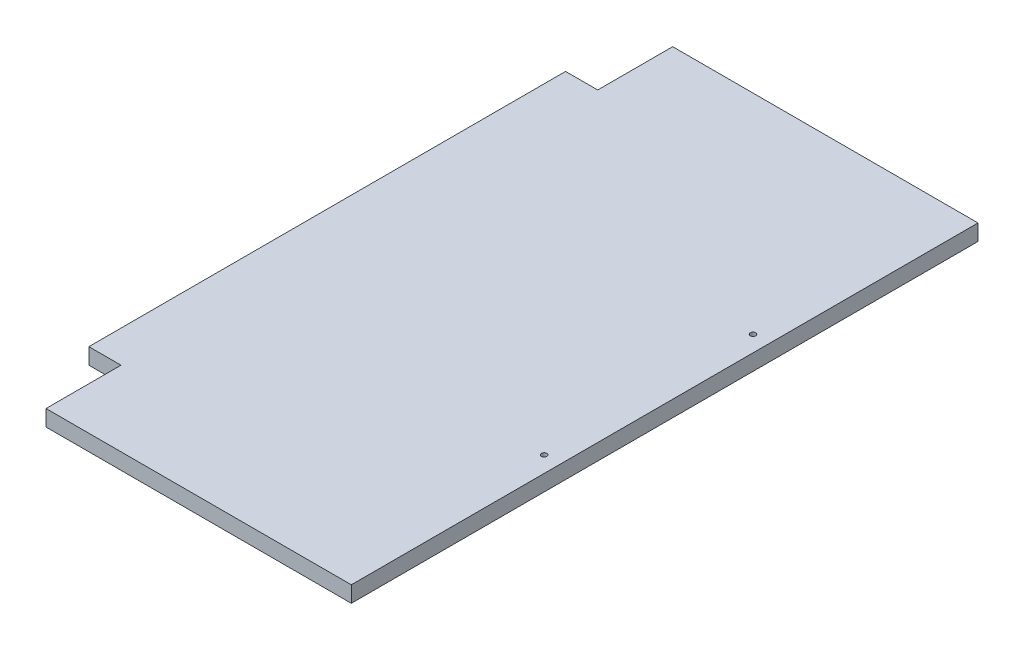
ISO-10303-21;
HEADER;
FILE_DESCRIPTION(('STEP AP214'),'2;1');
FILE_NAME('part.step','',(''),(''),'','','');
FILE_SCHEMA(('AUTOMOTIVE_DESIGN { 1 0 10303 214 1 1 1 1 }'));
ENDSEC;
DATA;
#1=APPLICATION_CONTEXT('core data for automotive mechanical design processes');
#2=APPLICATION_PROTOCOL_DEFINITION('international standard','automotive_design',2000,#1);
#3=PRODUCT_CONTEXT('',#1,'mechanical');
#4=PRODUCT('Part','Part','',(#3));
#5=PRODUCT_RELATED_PRODUCT_CATEGORY('part','',(#4));
#6=PRODUCT_DEFINITION_FORMATION('','',#4);
#7=PRODUCT_DEFINITION_CONTEXT('part definition',#1,'design');
#8=PRODUCT_DEFINITION('design','',#6,#7);
#9=PRODUCT_DEFINITION_SHAPE('','',#8);
#10=(LENGTH_UNIT() NAMED_UNIT(*) SI_UNIT(.MILLI.,.METRE.));
#11=(NAMED_UNIT(*) PLANE_ANGLE_UNIT() SI_UNIT($,.RADIAN.));
#12=(NAMED_UNIT(*) SI_UNIT($,.STERADIAN.) SOLID_ANGLE_UNIT());
#13=UNCERTAINTY_MEASURE_WITH_UNIT(LENGTH_MEASURE(1.E-05),#10,'distance_accuracy_value','');
#14=(GEOMETRIC_REPRESENTATION_CONTEXT(3) GLOBAL_UNCERTAINTY_ASSIGNED_CONTEXT((#13)) GLOBAL_UNIT_ASSIGNED_CONTEXT((#10,
#11,#12)) REPRESENTATION_CONTEXT('',''));
#15=CARTESIAN_POINT('',(0.,0.,0.));
#16=DIRECTION('',(0.,0.,1.));
#17=DIRECTION('',(1.,0.,0.));
#18=AXIS2_PLACEMENT_3D('',#15,#16,#17);
#19=CARTESIAN_POINT('',(0.,19.05,0.));
#20=DIRECTION('',(0.,-1.,0.));
#21=DIRECTION('',(0.,0.,-1.));
#22=AXIS2_PLACEMENT_3D('',#19,#20,#21);
#23=PLANE('',#22);
#24=DIRECTION('',(0.,0.,1.));
#25=VECTOR('',#24,1.);
#26=CARTESIAN_POINT('',(0.,19.05,565.15));
#27=LINE('',#26,#25);
#28=CARTESIAN_POINT('',(0.,19.05,0.));
#29=VERTEX_POINT('',#28);
#30=CARTESIAN_POINT('',(0.,19.05,565.15));
#31=VERTEX_POINT('',#30);
#32=EDGE_CURVE('E164',#29,#31,#27,.T.);
#33=ORIENTED_EDGE('',*,*,#32,.T.);
#34=DIRECTION('',(1.,0.,0.));
#35=VECTOR('',#34,1.);
#36=CARTESIAN_POINT('',(38.1,19.05,565.15));
#37=LINE('',#36,#35);
#38=CARTESIAN_POINT('',(38.1,19.05,565.15));
#39=VERTEX_POINT('',#38);
#40=EDGE_CURVE('E100',#31,#39,#37,.T.);
#41=ORIENTED_EDGE('',*,*,#40,.T.);
#42=DIRECTION('',(0.,0.,1.));
#43=VECTOR('',#42,1.);
#44=CARTESIAN_POINT('',(38.1,19.05,654.05));
#45=LINE('',#44,#43);
#46=CARTESIAN_POINT('',(38.1,19.05,654.05));
#47=VERTEX_POINT('',#46);
#48=EDGE_CURVE('E185',#39,#47,#45,.T.);
#49=ORIENTED_EDGE('',*,*,#48,.T.);
#50=DIRECTION('',(1.,0.,0.));
#51=VECTOR('',#50,1.);
#52=CARTESIAN_POINT('',(400.05,19.05,654.05));
#53=LINE('',#52,#51);
#54=CARTESIAN_POINT('',(400.05,19.05,654.05));
#55=VERTEX_POINT('',#54);
#56=EDGE_CURVE('E199',#47,#55,#53,.T.);
#57=ORIENTED_EDGE('',*,*,#56,.T.);
#58=DIRECTION('',(0.,0.,-1.));
#59=VECTOR('',#58,1.);
#60=CARTESIAN_POINT('',(400.05,19.05,-88.9));
#61=LINE('',#60,#59);
#62=CARTESIAN_POINT('',(400.05,19.05,-88.9));
#63=VERTEX_POINT('',#62);
#64=EDGE_CURVE('E119',#55,#63,#61,.T.);
#65=ORIENTED_EDGE('',*,*,#64,.T.);
#66=DIRECTION('',(-1.,0.,0.));
#67=VECTOR('',#66,1.);
#68=CARTESIAN_POINT('',(38.1,19.05,-88.9));
#69=LINE('',#68,#67);
#70=CARTESIAN_POINT('',(38.1,19.05,-88.9));
#71=VERTEX_POINT('',#70);
#72=EDGE_CURVE('E113',#63,#71,#69,.T.);
#73=ORIENTED_EDGE('',*,*,#72,.T.);
#74=DIRECTION('',(0.,0.,1.));
#75=VECTOR('',#74,1.);
#76=CARTESIAN_POINT('',(38.1,19.05,0.));
#77=LINE('',#76,#75);
#78=CARTESIAN_POINT('',(38.1,19.05,0.));
#79=VERTEX_POINT('',#78);
#80=EDGE_CURVE('E117',#71,#79,#77,.T.);
#81=ORIENTED_EDGE('',*,*,#80,.T.);
#82=DIRECTION('',(-1.,0.,0.));
#83=VECTOR('',#82,1.);
#84=CARTESIAN_POINT('',(0.,19.05,0.));
#85=LINE('',#84,#83);
#86=EDGE_CURVE('E57',#79,#29,#85,.T.);
#87=ORIENTED_EDGE('',*,*,#86,.T.);
#88=EDGE_LOOP('',(#33,#41,#49,#57,#65,#73,#81,#87));
#89=FACE_BOUND('',#88,.T.);
#90=CARTESIAN_POINT('',(381.,19.05,406.4));
#91=DIRECTION('',(0.,1.,0.));
#92=DIRECTION('',(0.,0.,1.));
#93=AXIS2_PLACEMENT_3D('',#90,#91,#92);
#94=CIRCLE('',#93,3.17499999999997);
#95=CARTESIAN_POINT('',(381.,19.05,403.225));
#96=VERTEX_POINT('',#95);
#97=EDGE_CURVE('E146',#96,#96,#94,.T.);
#98=ORIENTED_EDGE('',*,*,#97,.F.);
#99=EDGE_LOOP('',(#98));
#100=FACE_BOUND('',#99,.T.);
#101=CARTESIAN_POINT('',(381.,19.05,158.75));
#102=DIRECTION('',(0.,1.,0.));
#103=DIRECTION('',(0.,0.,1.));
#104=AXIS2_PLACEMENT_3D('',#101,#102,#103);
#105=CIRCLE('',#104,3.17499999999997);
#106=CARTESIAN_POINT('',(381.,19.05,155.575));
#107=VERTEX_POINT('',#106);
#108=EDGE_CURVE('E213',#107,#107,#105,.T.);
#109=ORIENTED_EDGE('',*,*,#108,.F.);
#110=EDGE_LOOP('',(#109));
#111=FACE_BOUND('',#110,.T.);
#112=ADVANCED_FACE('F39',(#89,#100,#111),#23,.F.);
#113=CARTESIAN_POINT('',(0.,0.,0.));
#114=DIRECTION('',(0.,-1.,0.));
#115=DIRECTION('',(0.,0.,-1.));
#116=AXIS2_PLACEMENT_3D('',#113,#114,#115);
#117=PLANE('',#116);
#118=CARTESIAN_POINT('',(381.,0.,406.4));
#119=DIRECTION('',(0.,1.,0.));
#120=DIRECTION('',(0.,0.,1.));
#121=AXIS2_PLACEMENT_3D('',#118,#119,#120);
#122=CIRCLE('',#121,3.17499999999997);
#123=CARTESIAN_POINT('',(381.,0.,403.225));
#124=VERTEX_POINT('',#123);
#125=EDGE_CURVE('E209',#124,#124,#122,.T.);
#126=ORIENTED_EDGE('',*,*,#125,.T.);
#127=EDGE_LOOP('',(#126));
#128=FACE_BOUND('',#127,.T.);
#129=DIRECTION('',(0.,0.,1.));
#130=VECTOR('',#129,1.);
#131=CARTESIAN_POINT('',(0.,0.,565.15));
#132=LINE('',#131,#130);
#133=CARTESIAN_POINT('',(0.,0.,0.));
#134=VERTEX_POINT('',#133);
#135=CARTESIAN_POINT('',(0.,0.,565.15));
#136=VERTEX_POINT('',#135);
#137=EDGE_CURVE('E141',#134,#136,#132,.T.);
#138=ORIENTED_EDGE('',*,*,#137,.F.);
#139=DIRECTION('',(-1.,0.,0.));
#140=VECTOR('',#139,1.);
#141=CARTESIAN_POINT('',(0.,0.,0.));
#142=LINE('',#141,#140);
#143=CARTESIAN_POINT('',(38.1,0.,0.));
#144=VERTEX_POINT('',#143);
#145=EDGE_CURVE('E92',#144,#134,#142,.T.);
#146=ORIENTED_EDGE('',*,*,#145,.F.);
#147=DIRECTION('',(0.,0.,1.));
#148=VECTOR('',#147,1.);
#149=CARTESIAN_POINT('',(38.1,0.,0.));
#150=LINE('',#149,#148);
#151=CARTESIAN_POINT('',(38.1,0.,-88.9));
#152=VERTEX_POINT('',#151);
#153=EDGE_CURVE('E86',#152,#144,#150,.T.);
#154=ORIENTED_EDGE('',*,*,#153,.F.);
#155=DIRECTION('',(-1.,0.,0.));
#156=VECTOR('',#155,1.);
#157=CARTESIAN_POINT('',(38.1,0.,-88.9));
#158=LINE('',#157,#156);
#159=CARTESIAN_POINT('',(400.05,0.,-88.9));
#160=VERTEX_POINT('',#159);
#161=EDGE_CURVE('E128',#160,#152,#158,.T.);
#162=ORIENTED_EDGE('',*,*,#161,.F.);
#163=DIRECTION('',(0.,0.,-1.));
#164=VECTOR('',#163,1.);
#165=CARTESIAN_POINT('',(400.05,0.,-88.9));
#166=LINE('',#165,#164);
#167=CARTESIAN_POINT('',(400.05,0.,654.05));
#168=VERTEX_POINT('',#167);
#169=EDGE_CURVE('E155',#168,#160,#166,.T.);
#170=ORIENTED_EDGE('',*,*,#169,.F.);
#171=DIRECTION('',(1.,0.,0.));
#172=VECTOR('',#171,1.);
#173=CARTESIAN_POINT('',(400.05,0.,654.05));
#174=LINE('',#173,#172);
#175=CARTESIAN_POINT('',(38.1,0.,654.05));
#176=VERTEX_POINT('',#175);
#177=EDGE_CURVE('E152',#176,#168,#174,.T.);
#178=ORIENTED_EDGE('',*,*,#177,.F.);
#179=DIRECTION('',(0.,0.,1.));
#180=VECTOR('',#179,1.);
#181=CARTESIAN_POINT('',(38.1,0.,654.05));
#182=LINE('',#181,#180);
#183=CARTESIAN_POINT('',(38.1,0.,565.15));
#184=VERTEX_POINT('',#183);
#185=EDGE_CURVE('E149',#184,#176,#182,.T.);
#186=ORIENTED_EDGE('',*,*,#185,.F.);
#187=DIRECTION('',(1.,0.,0.));
#188=VECTOR('',#187,1.);
#189=CARTESIAN_POINT('',(38.1,0.,565.15));
#190=LINE('',#189,#188);
#191=EDGE_CURVE('E145',#136,#184,#190,.T.);
#192=ORIENTED_EDGE('',*,*,#191,.F.);
#193=EDGE_LOOP('',(#138,#146,#154,#162,#170,#178,#186,#192));
#194=FACE_BOUND('',#193,.T.);
#195=CARTESIAN_POINT('',(381.,0.,158.75));
#196=DIRECTION('',(0.,1.,0.));
#197=DIRECTION('',(0.,0.,1.));
#198=AXIS2_PLACEMENT_3D('',#195,#196,#197);
#199=CIRCLE('',#198,3.17499999999997);
#200=CARTESIAN_POINT('',(381.,0.,155.575));
#201=VERTEX_POINT('',#200);
#202=EDGE_CURVE('E217',#201,#201,#199,.T.);
#203=ORIENTED_EDGE('',*,*,#202,.T.);
#204=EDGE_LOOP('',(#203));
#205=FACE_BOUND('',#204,.T.);
#206=ADVANCED_FACE('F189',(#128,#194,#205),#117,.T.);
#207=CARTESIAN_POINT('',(0.,19.05,565.15));
#208=DIRECTION('',(1.,0.,0.));
#209=DIRECTION('',(0.,0.,-1.));
#210=AXIS2_PLACEMENT_3D('',#207,#208,#209);
#211=PLANE('',#210);
#212=ORIENTED_EDGE('',*,*,#137,.T.);
#213=DIRECTION('',(0.,-1.,0.));
#214=VECTOR('',#213,1.);
#215=CARTESIAN_POINT('',(0.,19.05,565.15));
#216=LINE('',#215,#214);
#217=EDGE_CURVE('E11',#31,#136,#216,.T.);
#218=ORIENTED_EDGE('',*,*,#217,.F.);
#219=ORIENTED_EDGE('',*,*,#32,.F.);
#220=DIRECTION('',(0.,-1.,0.));
#221=VECTOR('',#220,1.);
#222=CARTESIAN_POINT('',(0.,19.05,0.));
#223=LINE('',#222,#221);
#224=EDGE_CURVE('E137',#29,#134,#223,.T.);
#225=ORIENTED_EDGE('',*,*,#224,.T.);
#226=EDGE_LOOP('',(#212,#218,#219,#225));
#227=FACE_BOUND('',#226,.T.);
#228=ADVANCED_FACE('F41',(#227),#211,.F.);
#229=CARTESIAN_POINT('',(38.1,19.05,565.15));
#230=DIRECTION('',(0.,0.,-1.));
#231=DIRECTION('',(-1.,0.,0.));
#232=AXIS2_PLACEMENT_3D('',#229,#230,#231);
#233=PLANE('',#232);
#234=ORIENTED_EDGE('',*,*,#191,.T.);
#235=DIRECTION('',(0.,-1.,0.));
#236=VECTOR('',#235,1.);
#237=CARTESIAN_POINT('',(38.1,19.05,565.15));
#238=LINE('',#237,#236);
#239=EDGE_CURVE('E49',#39,#184,#238,.T.);
#240=ORIENTED_EDGE('',*,*,#239,.F.);
#241=ORIENTED_EDGE('',*,*,#40,.F.);
#242=ORIENTED_EDGE('',*,*,#217,.T.);
#243=EDGE_LOOP('',(#234,#240,#241,#242));
#244=FACE_BOUND('',#243,.T.);
#245=ADVANCED_FACE('F251',(#244),#233,.F.);
#246=CARTESIAN_POINT('',(38.1,19.05,654.05));
#247=DIRECTION('',(1.,0.,0.));
#248=DIRECTION('',(0.,0.,-1.));
#249=AXIS2_PLACEMENT_3D('',#246,#247,#248);
#250=PLANE('',#249);
#251=ORIENTED_EDGE('',*,*,#185,.T.);
#252=DIRECTION('',(0.,-1.,0.));
#253=VECTOR('',#252,1.);
#254=CARTESIAN_POINT('',(38.1,19.05,654.05));
#255=LINE('',#254,#253);
#256=EDGE_CURVE('E175',#47,#176,#255,.T.);
#257=ORIENTED_EDGE('',*,*,#256,.F.);
#258=ORIENTED_EDGE('',*,*,#48,.F.);
#259=ORIENTED_EDGE('',*,*,#239,.T.);
#260=EDGE_LOOP('',(#251,#257,#258,#259));
#261=FACE_BOUND('',#260,.T.);
#262=ADVANCED_FACE('F183',(#261),#250,.F.);
#263=CARTESIAN_POINT('',(400.05,19.05,654.05));
#264=DIRECTION('',(0.,0.,-1.));
#265=DIRECTION('',(-1.,0.,0.));
#266=AXIS2_PLACEMENT_3D('',#263,#264,#265);
#267=PLANE('',#266);
#268=ORIENTED_EDGE('',*,*,#177,.T.);
#269=DIRECTION('',(0.,-1.,0.));
#270=VECTOR('',#269,1.);
#271=CARTESIAN_POINT('',(400.05,19.05,654.05));
#272=LINE('',#271,#270);
#273=EDGE_CURVE('E171',#55,#168,#272,.T.);
#274=ORIENTED_EDGE('',*,*,#273,.F.);
#275=ORIENTED_EDGE('',*,*,#56,.F.);
#276=ORIENTED_EDGE('',*,*,#256,.T.);
#277=EDGE_LOOP('',(#268,#274,#275,#276));
#278=FACE_BOUND('',#277,.T.);
#279=ADVANCED_FACE('F194',(#278),#267,.F.);
#280=CARTESIAN_POINT('',(400.05,19.05,-88.9));
#281=DIRECTION('',(-1.,0.,0.));
#282=DIRECTION('',(0.,0.,1.));
#283=AXIS2_PLACEMENT_3D('',#280,#281,#282);
#284=PLANE('',#283);
#285=ORIENTED_EDGE('',*,*,#169,.T.);
#286=DIRECTION('',(0.,-1.,0.));
#287=VECTOR('',#286,1.);
#288=CARTESIAN_POINT('',(400.05,19.05,-88.9));
#289=LINE('',#288,#287);
#290=EDGE_CURVE('E130',#63,#160,#289,.T.);
#291=ORIENTED_EDGE('',*,*,#290,.F.);
#292=ORIENTED_EDGE('',*,*,#64,.F.);
#293=ORIENTED_EDGE('',*,*,#273,.T.);
#294=EDGE_LOOP('',(#285,#291,#292,#293));
#295=FACE_BOUND('',#294,.T.);
#296=ADVANCED_FACE('F197',(#295),#284,.F.);
#297=CARTESIAN_POINT('',(38.1,19.05,-88.9));
#298=DIRECTION('',(0.,0.,1.));
#299=DIRECTION('',(1.,0.,0.));
#300=AXIS2_PLACEMENT_3D('',#297,#298,#299);
#301=PLANE('',#300);
#302=ORIENTED_EDGE('',*,*,#161,.T.);
#303=DIRECTION('',(0.,-1.,0.));
#304=VECTOR('',#303,1.);
#305=CARTESIAN_POINT('',(38.1,19.05,-88.9));
#306=LINE('',#305,#304);
#307=EDGE_CURVE('E125',#71,#152,#306,.T.);
#308=ORIENTED_EDGE('',*,*,#307,.F.);
#309=ORIENTED_EDGE('',*,*,#72,.F.);
#310=ORIENTED_EDGE('',*,*,#290,.T.);
#311=EDGE_LOOP('',(#302,#308,#309,#310));
#312=FACE_BOUND('',#311,.T.);
#313=ADVANCED_FACE('F126',(#312),#301,.F.);
#314=CARTESIAN_POINT('',(38.1,19.05,0.));
#315=DIRECTION('',(1.,0.,0.));
#316=DIRECTION('',(0.,0.,-1.));
#317=AXIS2_PLACEMENT_3D('',#314,#315,#316);
#318=PLANE('',#317);
#319=ORIENTED_EDGE('',*,*,#153,.T.);
#320=DIRECTION('',(0.,-1.,0.));
#321=VECTOR('',#320,1.);
#322=CARTESIAN_POINT('',(38.1,19.05,0.));
#323=LINE('',#322,#321);
#324=EDGE_CURVE('E131',#79,#144,#323,.T.);
#325=ORIENTED_EDGE('',*,*,#324,.F.);
#326=ORIENTED_EDGE('',*,*,#80,.F.);
#327=ORIENTED_EDGE('',*,*,#307,.T.);
#328=EDGE_LOOP('',(#319,#325,#326,#327));
#329=FACE_BOUND('',#328,.T.);
#330=ADVANCED_FACE('F133',(#329),#318,.F.);
#331=CARTESIAN_POINT('',(0.,19.05,0.));
#332=DIRECTION('',(0.,0.,1.));
#333=DIRECTION('',(1.,0.,0.));
#334=AXIS2_PLACEMENT_3D('',#331,#332,#333);
#335=PLANE('',#334);
#336=ORIENTED_EDGE('',*,*,#145,.T.);
#337=ORIENTED_EDGE('',*,*,#224,.F.);
#338=ORIENTED_EDGE('',*,*,#86,.F.);
#339=ORIENTED_EDGE('',*,*,#324,.T.);
#340=EDGE_LOOP('',(#336,#337,#338,#339));
#341=FACE_BOUND('',#340,.T.);
#342=ADVANCED_FACE('F239',(#341),#335,.F.);
#343=CARTESIAN_POINT('',(381.,19.05,406.4));
#344=DIRECTION('',(0.,-1.,0.));
#345=DIRECTION('',(0.,0.,-1.));
#346=AXIS2_PLACEMENT_3D('',#343,#344,#345);
#347=CYLINDRICAL_SURFACE('',#346,3.17499999999997);
#348=CARTESIAN_POINT('',(381.,19.05,403.225));
#349=CARTESIAN_POINT('',(381.,18.8515625,403.225));
#350=CARTESIAN_POINT('',(381.,18.653125,403.225));
#351=CARTESIAN_POINT('',(381.,18.25625,403.225));
#352=CARTESIAN_POINT('',(381.,18.0578125,403.225));
#353=CARTESIAN_POINT('',(381.,17.6609375,403.225));
#354=CARTESIAN_POINT('',(381.,17.4625,403.225));
#355=CARTESIAN_POINT('',(381.,17.065625,403.225));
#356=CARTESIAN_POINT('',(381.,16.8671875,403.225));
#357=CARTESIAN_POINT('',(381.,16.4703125,403.225));
#358=CARTESIAN_POINT('',(381.,16.271875,403.225));
#359=CARTESIAN_POINT('',(381.,15.875,403.225));
#360=CARTESIAN_POINT('',(381.,15.6765625,403.225));
#361=CARTESIAN_POINT('',(381.,15.2796875,403.225));
#362=CARTESIAN_POINT('',(381.,15.08125,403.225));
#363=CARTESIAN_POINT('',(381.,14.684375,403.225));
#364=CARTESIAN_POINT('',(381.,14.4859375,403.225));
#365=CARTESIAN_POINT('',(381.,14.0890625,403.225));
#366=CARTESIAN_POINT('',(381.,13.890625,403.225));
#367=CARTESIAN_POINT('',(381.,13.49375,403.225));
#368=CARTESIAN_POINT('',(381.,13.2953125,403.225));
#369=CARTESIAN_POINT('',(381.,12.8984375,403.225));
#370=CARTESIAN_POINT('',(381.,12.7,403.225));
#371=CARTESIAN_POINT('',(381.,12.303125,403.225));
#372=CARTESIAN_POINT('',(381.,12.1046875,403.225));
#373=CARTESIAN_POINT('',(381.,11.7078125,403.225));
#374=CARTESIAN_POINT('',(381.,11.509375,403.225));
#375=CARTESIAN_POINT('',(381.,11.1125,403.225));
#376=CARTESIAN_POINT('',(381.,10.9140625,403.225));
#377=CARTESIAN_POINT('',(381.,10.5171875,403.225));
#378=CARTESIAN_POINT('',(381.,10.31875,403.225));
#379=CARTESIAN_POINT('',(381.,9.921875,403.225));
#380=CARTESIAN_POINT('',(381.,9.7234375,403.225));
#381=CARTESIAN_POINT('',(381.,9.3265625,403.225));
#382=CARTESIAN_POINT('',(381.,9.128125,403.225));
#383=CARTESIAN_POINT('',(381.,8.73125,403.225));
#384=CARTESIAN_POINT('',(381.,8.5328125,403.225));
#385=CARTESIAN_POINT('',(381.,8.1359375,403.225));
#386=CARTESIAN_POINT('',(381.,7.9375,403.225));
#387=CARTESIAN_POINT('',(381.,7.540625,403.225));
#388=CARTESIAN_POINT('',(381.,7.3421875,403.225));
#389=CARTESIAN_POINT('',(381.,6.9453125,403.225));
#390=CARTESIAN_POINT('',(381.,6.746875,403.225));
#391=CARTESIAN_POINT('',(381.,6.35,403.225));
#392=CARTESIAN_POINT('',(381.,6.1515625,403.225));
#393=CARTESIAN_POINT('',(381.,5.7546875,403.225));
#394=CARTESIAN_POINT('',(381.,5.55625,403.225));
#395=CARTESIAN_POINT('',(381.,5.159375,403.225));
#396=CARTESIAN_POINT('',(381.,4.9609375,403.225));
#397=CARTESIAN_POINT('',(381.,4.5640625,403.225));
#398=CARTESIAN_POINT('',(381.,4.365625,403.225));
#399=CARTESIAN_POINT('',(381.,3.96875,403.225));
#400=CARTESIAN_POINT('',(381.,3.7703125,403.225));
#401=CARTESIAN_POINT('',(381.,3.3734375,403.225));
#402=CARTESIAN_POINT('',(381.,3.175,403.225));
#403=CARTESIAN_POINT('',(381.,2.778125,403.225));
#404=CARTESIAN_POINT('',(381.,2.5796875,403.225));
#405=CARTESIAN_POINT('',(381.,2.1828125,403.225));
#406=CARTESIAN_POINT('',(381.,1.984375,403.225));
#407=CARTESIAN_POINT('',(381.,1.5875,403.225));
#408=CARTESIAN_POINT('',(381.,1.3890625,403.225));
#409=CARTESIAN_POINT('',(381.,0.992187500000001,403.225));
#410=CARTESIAN_POINT('',(381.,0.793750000000001,403.225));
#411=CARTESIAN_POINT('',(381.,0.396875,403.225));
#412=CARTESIAN_POINT('',(381.,0.1984375,403.225));
#413=CARTESIAN_POINT('',(381.,0.,403.225));
#414=B_SPLINE_CURVE_WITH_KNOTS('',3,(#348,#349,#350,#351,#352,#353,#354,#355,#356,#357,#358,
#359,#360,#361,#362,#363,#364,#365,#366,#367,#368,#369,#370,#371,#372,#373,#374,#375,#376,#377,
#378,#379,#380,#381,#382,#383,#384,#385,#386,#387,#388,#389,#390,#391,#392,#393,#394,#395,#396,
#397,#398,#399,#400,#401,#402,#403,#404,#405,#406,#407,#408,#409,#410,#411,#412,#413),
.UNSPECIFIED.,.F.,.F.,(4,2,2,2,2,2,2,2,2,2,2,2,2,2,2,2,2,2,2,2,2,2,2,2,2,2,2,2,2,2,2,2,4),(0.,
0.595312499999997,1.190625,1.7859375,2.38125,2.9765625,3.571875,4.1671875,4.7625,5.3578125,
5.953125,6.5484375,7.14375,7.7390625,8.334375,8.9296875,9.525,10.1203125,10.715625,11.3109375,
11.90625,12.5015625,13.096875,13.6921875,14.2875,14.8828125,15.478125,16.0734375,16.66875,
17.2640625,17.859375,18.4546875,19.05),.UNSPECIFIED.);
#415=EDGE_CURVE('BSEAM236',#96,#124,#414,.T.);
#416=ORIENTED_EDGE('',*,*,#97,.T.);
#417=ORIENTED_EDGE('',*,*,#125,.F.);
#418=ORIENTED_EDGE('',*,*,#415,.T.);
#419=ORIENTED_EDGE('',*,*,#415,.F.);
#420=EDGE_LOOP('',(#416,#418,#417,#419));
#421=FACE_BOUND('',#420,.T.);
#422=ADVANCED_FACE('F236',(#421),#347,.F.);
#423=CARTESIAN_POINT('',(381.,19.05,158.75));
#424=DIRECTION('',(0.,-1.,0.));
#425=DIRECTION('',(0.,0.,-1.));
#426=AXIS2_PLACEMENT_3D('',#423,#424,#425);
#427=CYLINDRICAL_SURFACE('',#426,3.17499999999997);
#428=CARTESIAN_POINT('',(381.,19.05,155.575));
#429=CARTESIAN_POINT('',(381.,18.8515625,155.575));
#430=CARTESIAN_POINT('',(381.,18.653125,155.575));
#431=CARTESIAN_POINT('',(381.,18.25625,155.575));
#432=CARTESIAN_POINT('',(381.,18.0578125,155.575));
#433=CARTESIAN_POINT('',(381.,17.6609375,155.575));
#434=CARTESIAN_POINT('',(381.,17.4625,155.575));
#435=CARTESIAN_POINT('',(381.,17.065625,155.575));
#436=CARTESIAN_POINT('',(381.,16.8671875,155.575));
#437=CARTESIAN_POINT('',(381.,16.4703125,155.575));
#438=CARTESIAN_POINT('',(381.,16.271875,155.575));
#439=CARTESIAN_POINT('',(381.,15.875,155.575));
#440=CARTESIAN_POINT('',(381.,15.6765625,155.575));
#441=CARTESIAN_POINT('',(381.,15.2796875,155.575));
#442=CARTESIAN_POINT('',(381.,15.08125,155.575));
#443=CARTESIAN_POINT('',(381.,14.684375,155.575));
#444=CARTESIAN_POINT('',(381.,14.4859375,155.575));
#445=CARTESIAN_POINT('',(381.,14.0890625,155.575));
#446=CARTESIAN_POINT('',(381.,13.890625,155.575));
#447=CARTESIAN_POINT('',(381.,13.49375,155.575));
#448=CARTESIAN_POINT('',(381.,13.2953125,155.575));
#449=CARTESIAN_POINT('',(381.,12.8984375,155.575));
#450=CARTESIAN_POINT('',(381.,12.7,155.575));
#451=CARTESIAN_POINT('',(381.,12.303125,155.575));
#452=CARTESIAN_POINT('',(381.,12.1046875,155.575));
#453=CARTESIAN_POINT('',(381.,11.7078125,155.575));
#454=CARTESIAN_POINT('',(381.,11.509375,155.575));
#455=CARTESIAN_POINT('',(381.,11.1125,155.575));
#456=CARTESIAN_POINT('',(381.,10.9140625,155.575));
#457=CARTESIAN_POINT('',(381.,10.5171875,155.575));
#458=CARTESIAN_POINT('',(381.,10.31875,155.575));
#459=CARTESIAN_POINT('',(381.,9.921875,155.575));
#460=CARTESIAN_POINT('',(381.,9.7234375,155.575));
#461=CARTESIAN_POINT('',(381.,9.3265625,155.575));
#462=CARTESIAN_POINT('',(381.,9.128125,155.575));
#463=CARTESIAN_POINT('',(381.,8.73125,155.575));
#464=CARTESIAN_POINT('',(381.,8.5328125,155.575));
#465=CARTESIAN_POINT('',(381.,8.1359375,155.575));
#466=CARTESIAN_POINT('',(381.,7.9375,155.575));
#467=CARTESIAN_POINT('',(381.,7.540625,155.575));
#468=CARTESIAN_POINT('',(381.,7.3421875,155.575));
#469=CARTESIAN_POINT('',(381.,6.9453125,155.575));
#470=CARTESIAN_POINT('',(381.,6.746875,155.575));
#471=CARTESIAN_POINT('',(381.,6.35,155.575));
#472=CARTESIAN_POINT('',(381.,6.1515625,155.575));
#473=CARTESIAN_POINT('',(381.,5.7546875,155.575));
#474=CARTESIAN_POINT('',(381.,5.55625,155.575));
#475=CARTESIAN_POINT('',(381.,5.159375,155.575));
#476=CARTESIAN_POINT('',(381.,4.9609375,155.575));
#477=CARTESIAN_POINT('',(381.,4.5640625,155.575));
#478=CARTESIAN_POINT('',(381.,4.365625,155.575));
#479=CARTESIAN_POINT('',(381.,3.96875,155.575));
#480=CARTESIAN_POINT('',(381.,3.7703125,155.575));
#481=CARTESIAN_POINT('',(381.,3.3734375,155.575));
#482=CARTESIAN_POINT('',(381.,3.175,155.575));
#483=CARTESIAN_POINT('',(381.,2.778125,155.575));
#484=CARTESIAN_POINT('',(381.,2.5796875,155.575));
#485=CARTESIAN_POINT('',(381.,2.1828125,155.575));
#486=CARTESIAN_POINT('',(381.,1.984375,155.575));
#487=CARTESIAN_POINT('',(381.,1.5875,155.575));
#488=CARTESIAN_POINT('',(381.,1.3890625,155.575));
#489=CARTESIAN_POINT('',(381.,0.992187500000001,155.575));
#490=CARTESIAN_POINT('',(381.,0.793750000000001,155.575));
#491=CARTESIAN_POINT('',(381.,0.396875,155.575));
#492=CARTESIAN_POINT('',(381.,0.1984375,155.575));
#493=CARTESIAN_POINT('',(381.,0.,155.575));
#494=B_SPLINE_CURVE_WITH_KNOTS('',3,(#428,#429,#430,#431,#432,#433,#434,#435,#436,#437,#438,
#439,#440,#441,#442,#443,#444,#445,#446,#447,#448,#449,#450,#451,#452,#453,#454,#455,#456,#457,
#458,#459,#460,#461,#462,#463,#464,#465,#466,#467,#468,#469,#470,#471,#472,#473,#474,#475,#476,
#477,#478,#479,#480,#481,#482,#483,#484,#485,#486,#487,#488,#489,#490,#491,#492,#493),
.UNSPECIFIED.,.F.,.F.,(4,2,2,2,2,2,2,2,2,2,2,2,2,2,2,2,2,2,2,2,2,2,2,2,2,2,2,2,2,2,2,2,4),(0.,
0.595312499999997,1.190625,1.7859375,2.38125,2.9765625,3.571875,4.1671875,4.7625,5.3578125,
5.953125,6.5484375,7.14375,7.7390625,8.334375,8.9296875,9.525,10.1203125,10.715625,11.3109375,
11.90625,12.5015625,13.096875,13.6921875,14.2875,14.8828125,15.478125,16.0734375,16.66875,
17.2640625,17.859375,18.4546875,19.05),.UNSPECIFIED.);
#495=EDGE_CURVE('BSEAM225',#107,#201,#494,.T.);
#496=ORIENTED_EDGE('',*,*,#108,.T.);
#497=ORIENTED_EDGE('',*,*,#202,.F.);
#498=ORIENTED_EDGE('',*,*,#495,.T.);
#499=ORIENTED_EDGE('',*,*,#495,.F.);
#500=EDGE_LOOP('',(#496,#498,#497,#499));
#501=FACE_BOUND('',#500,.T.);
#502=ADVANCED_FACE('F225',(#501),#427,.F.);
#503=CLOSED_SHELL('',(#112,#206,#228,#245,#262,#279,#296,#313,#330,#342,#422,#502));
#504=MANIFOLD_SOLID_BREP('B2',#503);
#505=ADVANCED_BREP_SHAPE_REPRESENTATION('',(#18,#504),#14);
#506=SHAPE_DEFINITION_REPRESENTATION(#9,#505);
ENDSEC;
END-ISO-10303-21;
